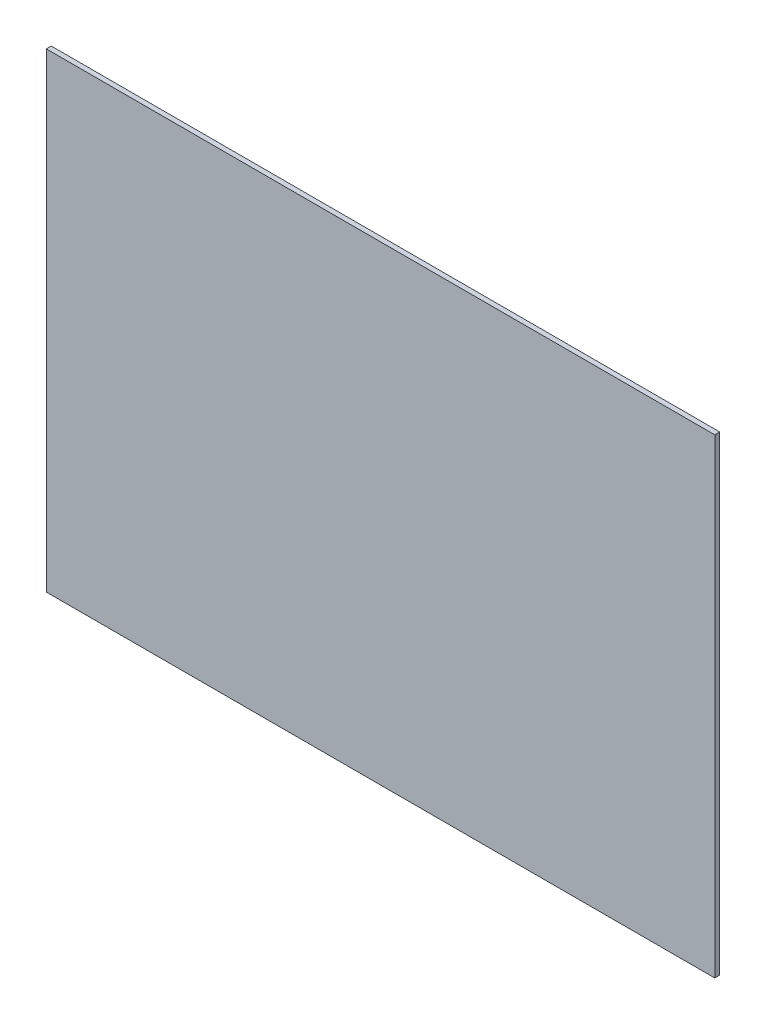
ISO-10303-21;
HEADER;
FILE_DESCRIPTION(('STEP AP214'),'2;1');
FILE_NAME('part.step','',(''),(''),'','','');
FILE_SCHEMA(('AUTOMOTIVE_DESIGN { 1 0 10303 214 1 1 1 1 }'));
ENDSEC;
DATA;
#1=APPLICATION_CONTEXT('core data for automotive mechanical design processes');
#2=APPLICATION_PROTOCOL_DEFINITION('international standard','automotive_design',2000,#1);
#3=PRODUCT_CONTEXT('',#1,'mechanical');
#4=PRODUCT('Part','Part','',(#3));
#5=PRODUCT_RELATED_PRODUCT_CATEGORY('part','',(#4));
#6=PRODUCT_DEFINITION_FORMATION('','',#4);
#7=PRODUCT_DEFINITION_CONTEXT('part definition',#1,'design');
#8=PRODUCT_DEFINITION('design','',#6,#7);
#9=PRODUCT_DEFINITION_SHAPE('','',#8);
#10=(LENGTH_UNIT() NAMED_UNIT(*) SI_UNIT(.MILLI.,.METRE.));
#11=(NAMED_UNIT(*) PLANE_ANGLE_UNIT() SI_UNIT($,.RADIAN.));
#12=(NAMED_UNIT(*) SI_UNIT($,.STERADIAN.) SOLID_ANGLE_UNIT());
#13=UNCERTAINTY_MEASURE_WITH_UNIT(LENGTH_MEASURE(1.E-05),#10,'distance_accuracy_value','');
#14=(GEOMETRIC_REPRESENTATION_CONTEXT(3) GLOBAL_UNCERTAINTY_ASSIGNED_CONTEXT((#13)) GLOBAL_UNIT_ASSIGNED_CONTEXT((#10,
#11,#12)) REPRESENTATION_CONTEXT('',''));
#15=CARTESIAN_POINT('',(0.,0.,0.));
#16=DIRECTION('',(0.,0.,1.));
#17=DIRECTION('',(1.,0.,0.));
#18=AXIS2_PLACEMENT_3D('',#15,#16,#17);
#19=CARTESIAN_POINT('',(-5.499993030605,-6.50000066,0.));
#20=DIRECTION('',(0.,0.,1.));
#21=DIRECTION('',(1.,0.,0.));
#22=AXIS2_PLACEMENT_3D('',#19,#20,#21);
#23=PLANE('',#22);
#24=DIRECTION('',(-1.19248806385E-08,1.,0.));
#25=VECTOR('',#24,1.);
#26=CARTESIAN_POINT('',(-4.824993017786,-7.575000651951,0.));
#27=LINE('',#26,#25);
#28=CARTESIAN_POINT('',(-4.82499302494098,-6.9750006559756,0.));
#29=VERTEX_POINT('',#28);
#30=CARTESIAN_POINT('',(-4.82499303343753,-6.0250006519508,0.));
#31=VERTEX_POINT('',#30);
#32=EDGE_CURVE('E68',#29,#31,#27,.T.);
#33=ORIENTED_EDGE('',*,*,#32,.F.);
#34=DIRECTION('',(1.,1.19248806385E-08,0.));
#35=VECTOR('',#34,1.);
#36=CARTESIAN_POINT('',(-6.420548195737,-6.975000670978,0.));
#37=LINE('',#36,#35);
#38=CARTESIAN_POINT('',(-6.17499302777347,-6.9750006680492,0.));
#39=VERTEX_POINT('',#38);
#40=EDGE_CURVE('E55',#39,#29,#37,.T.);
#41=ORIENTED_EDGE('',*,*,#40,.F.);
#42=DIRECTION('',(1.19248806385E-08,-1.,0.));
#43=VECTOR('',#42,1.);
#44=CARTESIAN_POINT('',(-6.174993043425,-5.425000668049,0.));
#45=LINE('',#44,#43);
#46=CARTESIAN_POINT('',(-6.17499303627004,-6.02500066402445,0.));
#47=VERTEX_POINT('',#46);
#48=EDGE_CURVE('E20',#47,#39,#45,.T.);
#49=ORIENTED_EDGE('',*,*,#48,.F.);
#50=DIRECTION('',(-1.,-1.19248806385E-08,0.));
#51=VECTOR('',#50,1.);
#52=CARTESIAN_POINT('',(-4.579437865474,-6.025000649022,0.));
#53=LINE('',#52,#51);
#54=EDGE_CURVE('E81',#31,#47,#53,.T.);
#55=ORIENTED_EDGE('',*,*,#54,.F.);
#56=EDGE_LOOP('',(#33,#41,#49,#55));
#57=FACE_BOUND('',#56,.T.);
#58=ADVANCED_FACE('F17',(#57),#23,.F.);
#59=CARTESIAN_POINT('',(-6.174993043425,-5.425000668049,0.));
#60=DIRECTION('',(-1.,-1.19248806385E-08,0.));
#61=DIRECTION('',(1.19248806385E-08,-1.,0.));
#62=AXIS2_PLACEMENT_3D('',#59,#60,#61);
#63=PLANE('',#62);
#64=DIRECTION('',(0.,0.,1.));
#65=VECTOR('',#64,1.);
#66=CARTESIAN_POINT('',(-6.174993024941,-6.97500066804978,0.));
#67=LINE('',#66,#65);
#68=CARTESIAN_POINT('',(-6.17499302777347,-6.9750006680492,0.01));
#69=VERTEX_POINT('',#68);
#70=EDGE_CURVE('E61',#69,#39,#67,.F.);
#71=ORIENTED_EDGE('',*,*,#70,.F.);
#72=DIRECTION('',(0.,1.,0.));
#73=VECTOR('',#72,1.);
#74=CARTESIAN_POINT('',(-6.17499303627,-6.50000066,0.01));
#75=LINE('',#74,#73);
#76=CARTESIAN_POINT('',(-6.17499303627004,-6.02500066402445,0.01));
#77=VERTEX_POINT('',#76);
#78=EDGE_CURVE('E83',#77,#69,#75,.F.);
#79=ORIENTED_EDGE('',*,*,#78,.F.);
#80=DIRECTION('',(0.,0.,1.));
#81=VECTOR('',#80,1.);
#82=CARTESIAN_POINT('',(-6.17499303627,-6.02500066804881,0.));
#83=LINE('',#82,#81);
#84=EDGE_CURVE('E64',#47,#77,#83,.T.);
#85=ORIENTED_EDGE('',*,*,#84,.F.);
#86=ORIENTED_EDGE('',*,*,#48,.T.);
#87=EDGE_LOOP('',(#71,#79,#85,#86));
#88=FACE_BOUND('',#87,.T.);
#89=ADVANCED_FACE('F60',(#88),#63,.T.);
#90=CARTESIAN_POINT('',(-6.420548195737,-6.975000670978,0.));
#91=DIRECTION('',(1.19248806385E-08,-1.,0.));
#92=DIRECTION('',(1.,1.19248806385E-08,0.));
#93=AXIS2_PLACEMENT_3D('',#90,#91,#92);
#94=PLANE('',#93);
#95=DIRECTION('',(0.,0.,1.));
#96=VECTOR('',#95,1.);
#97=CARTESIAN_POINT('',(-4.82499302494093,-6.975000651951,0.));
#98=LINE('',#97,#96);
#99=CARTESIAN_POINT('',(-4.82499302494098,-6.9750006559756,0.01));
#100=VERTEX_POINT('',#99);
#101=EDGE_CURVE('E70',#100,#29,#98,.F.);
#102=ORIENTED_EDGE('',*,*,#101,.F.);
#103=DIRECTION('',(1.,0.,0.));
#104=VECTOR('',#103,1.);
#105=CARTESIAN_POINT('',(-5.499993030605,-6.975000668049,0.01));
#106=LINE('',#105,#104);
#107=EDGE_CURVE('E74',#69,#100,#106,.T.);
#108=ORIENTED_EDGE('',*,*,#107,.F.);
#109=ORIENTED_EDGE('',*,*,#70,.T.);
#110=ORIENTED_EDGE('',*,*,#40,.T.);
#111=EDGE_LOOP('',(#102,#108,#109,#110));
#112=FACE_BOUND('',#111,.T.);
#113=ADVANCED_FACE('F72',(#112),#94,.T.);
#114=CARTESIAN_POINT('',(-4.824993017786,-7.575000651951,0.));
#115=DIRECTION('',(1.,1.19248806385E-08,0.));
#116=DIRECTION('',(-1.19248806385E-08,1.,0.));
#117=AXIS2_PLACEMENT_3D('',#114,#115,#116);
#118=PLANE('',#117);
#119=ORIENTED_EDGE('',*,*,#101,.T.);
#120=ORIENTED_EDGE('',*,*,#32,.T.);
#121=DIRECTION('',(0.,0.,1.));
#122=VECTOR('',#121,1.);
#123=CARTESIAN_POINT('',(-4.82499303627,-6.02500065195022,0.));
#124=LINE('',#123,#122);
#125=CARTESIAN_POINT('',(-4.82499303343753,-6.0250006519508,0.01));
#126=VERTEX_POINT('',#125);
#127=EDGE_CURVE('E35',#126,#31,#124,.F.);
#128=ORIENTED_EDGE('',*,*,#127,.F.);
#129=DIRECTION('',(0.,1.,0.));
#130=VECTOR('',#129,1.);
#131=CARTESIAN_POINT('',(-4.824993024941,-6.50000066,0.01));
#132=LINE('',#131,#130);
#133=EDGE_CURVE('E26',#100,#126,#132,.T.);
#134=ORIENTED_EDGE('',*,*,#133,.F.);
#135=EDGE_LOOP('',(#119,#120,#128,#134));
#136=FACE_BOUND('',#135,.T.);
#137=ADVANCED_FACE('F89',(#136),#118,.T.);
#138=CARTESIAN_POINT('',(-4.579437865474,-6.025000649022,0.));
#139=DIRECTION('',(-1.19248806385E-08,1.,0.));
#140=DIRECTION('',(-1.,-1.19248806385E-08,0.));
#141=AXIS2_PLACEMENT_3D('',#138,#139,#140);
#142=PLANE('',#141);
#143=ORIENTED_EDGE('',*,*,#127,.T.);
#144=ORIENTED_EDGE('',*,*,#54,.T.);
#145=ORIENTED_EDGE('',*,*,#84,.T.);
#146=DIRECTION('',(1.,0.,0.));
#147=VECTOR('',#146,1.);
#148=CARTESIAN_POINT('',(-5.499993030605,-6.025000651951,0.01));
#149=LINE('',#148,#147);
#150=EDGE_CURVE('E11',#126,#77,#149,.F.);
#151=ORIENTED_EDGE('',*,*,#150,.F.);
#152=EDGE_LOOP('',(#143,#144,#145,#151));
#153=FACE_BOUND('',#152,.T.);
#154=ADVANCED_FACE('F91',(#153),#142,.T.);
#155=CARTESIAN_POINT('',(-5.499993030605,-6.50000066,0.01));
#156=DIRECTION('',(0.,0.,1.));
#157=DIRECTION('',(1.,0.,0.));
#158=AXIS2_PLACEMENT_3D('',#155,#156,#157);
#159=PLANE('',#158);
#160=ORIENTED_EDGE('',*,*,#133,.T.);
#161=ORIENTED_EDGE('',*,*,#150,.T.);
#162=ORIENTED_EDGE('',*,*,#78,.T.);
#163=ORIENTED_EDGE('',*,*,#107,.T.);
#164=EDGE_LOOP('',(#160,#161,#162,#163));
#165=FACE_BOUND('',#164,.T.);
#166=ADVANCED_FACE('F88',(#165),#159,.T.);
#167=CLOSED_SHELL('',(#58,#89,#113,#137,#154,#166));
#168=MANIFOLD_SOLID_BREP('B1',#167);
#169=ADVANCED_BREP_SHAPE_REPRESENTATION('',(#18,#168),#14);
#170=SHAPE_DEFINITION_REPRESENTATION(#9,#169);
ENDSEC;
END-ISO-10303-21;
